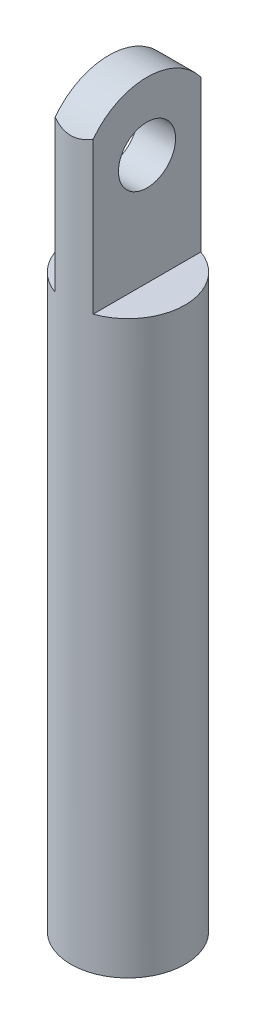
ISO-10303-21;
HEADER;
FILE_DESCRIPTION(('STEP AP214'),'2;1');
FILE_NAME('part.step','',(''),(''),'','','');
FILE_SCHEMA(('AUTOMOTIVE_DESIGN { 1 0 10303 214 1 1 1 1 }'));
ENDSEC;
DATA;
#1=APPLICATION_CONTEXT('core data for automotive mechanical design processes');
#2=APPLICATION_PROTOCOL_DEFINITION('international standard','automotive_design',2000,#1);
#3=PRODUCT_CONTEXT('',#1,'mechanical');
#4=PRODUCT('Part','Part','',(#3));
#5=PRODUCT_RELATED_PRODUCT_CATEGORY('part','',(#4));
#6=PRODUCT_DEFINITION_FORMATION('','',#4);
#7=PRODUCT_DEFINITION_CONTEXT('part definition',#1,'design');
#8=PRODUCT_DEFINITION('design','',#6,#7);
#9=PRODUCT_DEFINITION_SHAPE('','',#8);
#10=(LENGTH_UNIT() NAMED_UNIT(*) SI_UNIT(.MILLI.,.METRE.));
#11=(NAMED_UNIT(*) PLANE_ANGLE_UNIT() SI_UNIT($,.RADIAN.));
#12=(NAMED_UNIT(*) SI_UNIT($,.STERADIAN.) SOLID_ANGLE_UNIT());
#13=UNCERTAINTY_MEASURE_WITH_UNIT(LENGTH_MEASURE(1.E-05),#10,'distance_accuracy_value','');
#14=(GEOMETRIC_REPRESENTATION_CONTEXT(3) GLOBAL_UNCERTAINTY_ASSIGNED_CONTEXT((#13)) GLOBAL_UNIT_ASSIGNED_CONTEXT((#10,
#11,#12)) REPRESENTATION_CONTEXT('',''));
#15=CARTESIAN_POINT('',(0.,0.,0.));
#16=DIRECTION('',(0.,0.,1.));
#17=DIRECTION('',(1.,0.,0.));
#18=AXIS2_PLACEMENT_3D('',#15,#16,#17);
#19=CARTESIAN_POINT('',(1.,10.,0.));
#20=DIRECTION('',(-1.,0.,0.));
#21=DIRECTION('',(0.,0.,1.));
#22=AXIS2_PLACEMENT_3D('',#19,#20,#21);
#23=PLANE('',#22);
#24=CARTESIAN_POINT('',(1.,5.82865668476738,0.));
#25=DIRECTION('',(1.,0.,0.));
#26=DIRECTION('',(0.,0.,-1.));
#27=AXIS2_PLACEMENT_3D('',#24,#25,#26);
#28=CIRCLE('',#27,1.5);
#29=CARTESIAN_POINT('',(1.,5.82865668476738,-1.5));
#30=VERTEX_POINT('',#29);
#31=EDGE_CURVE('E103',#30,#30,#28,.T.);
#32=ORIENTED_EDGE('',*,*,#31,.F.);
#33=EDGE_LOOP('',(#32));
#34=FACE_BOUND('',#33,.T.);
#35=DIRECTION('',(0.,-1.,0.));
#36=VECTOR('',#35,1.);
#37=CARTESIAN_POINT('',(1.,10.,-2.82842712474619));
#38=LINE('',#37,#36);
#39=CARTESIAN_POINT('',(1.,7.96025182246292,-2.82842712474619));
#40=VERTEX_POINT('',#39);
#41=CARTESIAN_POINT('',(1.,0.,-2.82842712474619));
#42=VERTEX_POINT('',#41);
#43=EDGE_CURVE('E89',#40,#42,#38,.T.);
#44=ORIENTED_EDGE('',*,*,#43,.F.);
#45=CARTESIAN_POINT('',(1.,5.82865668476738,0.));
#46=DIRECTION('',(-1.,0.,0.));
#47=DIRECTION('',(0.,0.,1.));
#48=AXIS2_PLACEMENT_3D('',#45,#46,#47);
#49=CIRCLE('',#48,3.54170832100093);
#50=CARTESIAN_POINT('',(1.,7.96025182246292,2.82842712474619));
#51=VERTEX_POINT('',#50);
#52=EDGE_CURVE('E109',#40,#51,#49,.F.);
#53=ORIENTED_EDGE('',*,*,#52,.T.);
#54=DIRECTION('',(0.,-1.,0.));
#55=VECTOR('',#54,1.);
#56=CARTESIAN_POINT('',(1.,10.,2.82842712474619));
#57=LINE('',#56,#55);
#58=CARTESIAN_POINT('',(1.,0.,2.82842712474619));
#59=VERTEX_POINT('',#58);
#60=EDGE_CURVE('E83',#51,#59,#57,.T.);
#61=ORIENTED_EDGE('',*,*,#60,.T.);
#62=DIRECTION('',(0.,0.,-1.));
#63=VECTOR('',#62,1.);
#64=CARTESIAN_POINT('',(1.,0.,0.));
#65=LINE('',#64,#63);
#66=EDGE_CURVE('E102',#59,#42,#65,.T.);
#67=ORIENTED_EDGE('',*,*,#66,.T.);
#68=EDGE_LOOP('',(#44,#53,#61,#67));
#69=FACE_BOUND('',#68,.T.);
#70=ADVANCED_FACE('F33',(#34,#69),#23,.F.);
#71=CARTESIAN_POINT('',(-1.,10.,0.));
#72=DIRECTION('',(-1.,0.,0.));
#73=DIRECTION('',(0.,0.,1.));
#74=AXIS2_PLACEMENT_3D('',#71,#72,#73);
#75=PLANE('',#74);
#76=CARTESIAN_POINT('',(-0.999999999999999,5.82865668476738,0.));
#77=DIRECTION('',(-1.,0.,0.));
#78=DIRECTION('',(0.,0.,1.));
#79=AXIS2_PLACEMENT_3D('',#76,#77,#78);
#80=CIRCLE('',#79,1.5);
#81=CARTESIAN_POINT('',(-0.999999999999999,5.82865668476738,1.5));
#82=VERTEX_POINT('',#81);
#83=EDGE_CURVE('E100',#82,#82,#80,.T.);
#84=ORIENTED_EDGE('',*,*,#83,.F.);
#85=EDGE_LOOP('',(#84));
#86=FACE_BOUND('',#85,.T.);
#87=CARTESIAN_POINT('',(-1.,5.82865668476738,0.));
#88=DIRECTION('',(-1.,0.,0.));
#89=DIRECTION('',(0.,0.,1.));
#90=AXIS2_PLACEMENT_3D('',#87,#88,#89);
#91=CIRCLE('',#90,3.54170832100093);
#92=CARTESIAN_POINT('',(-1.,7.96025182246292,-2.82842712474619));
#93=VERTEX_POINT('',#92);
#94=CARTESIAN_POINT('',(-1.,7.96025182246292,2.82842712474619));
#95=VERTEX_POINT('',#94);
#96=EDGE_CURVE('E11',#93,#95,#91,.F.);
#97=ORIENTED_EDGE('',*,*,#96,.F.);
#98=DIRECTION('',(0.,-1.,0.));
#99=VECTOR('',#98,1.);
#100=CARTESIAN_POINT('',(-1.,10.,-2.82842712474619));
#101=LINE('',#100,#99);
#102=CARTESIAN_POINT('',(-1.,0.,-2.82842712474619));
#103=VERTEX_POINT('',#102);
#104=EDGE_CURVE('E55',#93,#103,#101,.T.);
#105=ORIENTED_EDGE('',*,*,#104,.T.);
#106=DIRECTION('',(0.,0.,-1.));
#107=VECTOR('',#106,1.);
#108=CARTESIAN_POINT('',(-1.,0.,0.));
#109=LINE('',#108,#107);
#110=CARTESIAN_POINT('',(-1.,0.,2.82842712474619));
#111=VERTEX_POINT('',#110);
#112=EDGE_CURVE('E86',#111,#103,#109,.T.);
#113=ORIENTED_EDGE('',*,*,#112,.F.);
#114=DIRECTION('',(0.,-1.,0.));
#115=VECTOR('',#114,1.);
#116=CARTESIAN_POINT('',(-1.,10.,2.82842712474619));
#117=LINE('',#116,#115);
#118=EDGE_CURVE('E81',#95,#111,#117,.T.);
#119=ORIENTED_EDGE('',*,*,#118,.F.);
#120=EDGE_LOOP('',(#97,#105,#113,#119));
#121=FACE_BOUND('',#120,.T.);
#122=ADVANCED_FACE('F85',(#86,#121),#75,.T.);
#123=CARTESIAN_POINT('',(0.,0.,0.));
#124=DIRECTION('',(0.,1.,0.));
#125=DIRECTION('',(0.,0.,1.));
#126=AXIS2_PLACEMENT_3D('',#123,#124,#125);
#127=PLANE('',#126);
#128=CARTESIAN_POINT('',(0.,0.,0.));
#129=DIRECTION('',(0.,1.,0.));
#130=DIRECTION('',(0.,0.,1.));
#131=AXIS2_PLACEMENT_3D('',#128,#129,#130);
#132=CIRCLE('',#131,3.);
#133=EDGE_CURVE('E95',#103,#111,#132,.T.);
#134=ORIENTED_EDGE('',*,*,#133,.T.);
#135=ORIENTED_EDGE('',*,*,#112,.T.);
#136=EDGE_LOOP('',(#134,#135));
#137=FACE_BOUND('',#136,.T.);
#138=ADVANCED_FACE('F115',(#137),#127,.T.);
#139=CARTESIAN_POINT('',(0.,-30.,0.));
#140=DIRECTION('',(0.,1.,0.));
#141=DIRECTION('',(0.,0.,1.));
#142=AXIS2_PLACEMENT_3D('',#139,#140,#141);
#143=CYLINDRICAL_SURFACE('',#142,3.);
#144=CARTESIAN_POINT('',(0.,7.71112788801253,3.));
#145=CARTESIAN_POINT('',(0.103039318652545,7.71115385013826,2.99999054103832));
#146=CARTESIAN_POINT('',(0.206177332899057,7.71977385244027,2.9946264519805));
#147=CARTESIAN_POINT('',(0.409049971081578,7.75241764328388,2.97374819598357));
#148=CARTESIAN_POINT('',(0.508771738545802,7.7764940512868,2.95819935259368));
#149=CARTESIAN_POINT('',(0.742135241413177,7.84794853551902,2.91009346799059));
#150=CARTESIAN_POINT('',(0.873136682748407,7.9008163526107,2.87319653082689));
#151=CARTESIAN_POINT('',(1.12434906923094,8.01850829985186,2.784546060522));
#152=CARTESIAN_POINT('',(1.24452410241534,8.08337018971621,2.73274531265367));
#153=CARTESIAN_POINT('',(1.4453415917332,8.20098862441561,2.63062503896126));
#154=CARTESIAN_POINT('',(1.5282295373278,8.25259425137355,2.583320063074));
#155=CARTESIAN_POINT('',(1.6887346112858,8.35685498616701,2.48137555261116));
#156=CARTESIAN_POINT('',(1.76634928401175,8.40951056837757,2.42673263571073));
#157=CARTESIAN_POINT('',(1.9161869606827,8.51428782376287,2.31024180271093));
#158=CARTESIAN_POINT('',(1.98841583434705,8.56641002314873,2.24840192425155));
#159=CARTESIAN_POINT('',(2.12731967601716,8.66890210196454,2.11745666369643));
#160=CARTESIAN_POINT('',(2.19399407710927,8.71927180222201,2.04835054160058));
#161=CARTESIAN_POINT('',(2.35716306485861,8.84458744146691,1.86188305207283));
#162=CARTESIAN_POINT('',(2.44935703940351,8.91743565768734,1.7392295429631));
#163=CARTESIAN_POINT('',(2.61600600200821,9.05119247249882,1.47668362584459));
#164=CARTESIAN_POINT('',(2.69049065928846,9.11212100988093,1.33682065493431));
#165=CARTESIAN_POINT('',(2.80659196738682,9.20797445585653,1.06794508096358));
#166=CARTESIAN_POINT('',(2.85169602382853,9.24559542423596,0.94141349820674));
#167=CARTESIAN_POINT('',(2.92498565115165,9.3069947708024,0.680298211741778));
#168=CARTESIAN_POINT('',(2.95318100541261,9.33078115344366,0.545719213941322));
#169=CARTESIAN_POINT('',(2.99090904818174,9.36265315559038,0.271467236610506));
#170=CARTESIAN_POINT('',(3.00035746900953,9.37066787999315,0.131774117973588));
#171=CARTESIAN_POINT('',(2.99962186603388,9.37004462732994,-0.147521500665713));
#172=CARTESIAN_POINT('',(2.98943925268788,9.36140784664716,-0.287124006457586));
#173=CARTESIAN_POINT('',(2.95165456482422,9.32949535452524,-0.551625778148248));
#174=CARTESIAN_POINT('',(2.92537382179841,9.30733048197429,-0.676855798242172));
#175=CARTESIAN_POINT('',(2.85811542795837,9.25096392118097,-0.92040814447713));
#176=CARTESIAN_POINT('',(2.81713550306877,9.21676037047877,-1.03872939848415));
#177=CARTESIAN_POINT('',(2.71852958738462,9.1352056226955,-1.27568450495714));
#178=CARTESIAN_POINT('',(2.65983021117627,9.0870184957925,-1.39357874980171));
#179=CARTESIAN_POINT('',(2.52975150388655,8.98173384856214,-1.6177733837655));
#180=CARTESIAN_POINT('',(2.45836199032654,8.92462917736296,-1.7240643511166));
#181=CARTESIAN_POINT('',(2.26688744382456,8.77438531821928,-1.97403053665483));
#182=CARTESIAN_POINT('',(2.14013522219518,8.6773496478751,-2.11033788412406));
#183=CARTESIAN_POINT('',(1.93494502413457,8.52783068832281,-2.29444284863379));
#184=CARTESIAN_POINT('',(1.86391710041156,8.47724927376051,-2.35249201353474));
#185=CARTESIAN_POINT('',(1.71692392406109,8.37594840609881,-2.46181765333375));
#186=CARTESIAN_POINT('',(1.64096030504557,8.3252290039421,-2.51309635224789));
#187=CARTESIAN_POINT('',(1.44277030179379,8.19861350682885,-2.63403776869418));
#188=CARTESIAN_POINT('',(1.31723385046741,8.12351303784083,-2.69917567063907));
#189=CARTESIAN_POINT('',(1.05374505470651,7.9831072833384,-2.81249008221413));
#190=CARTESIAN_POINT('',(0.915830879656366,7.9177734358994,-2.86071662784522));
#191=CARTESIAN_POINT('',(0.679643259389638,7.82828405232621,-2.92353040552561));
#192=CARTESIAN_POINT('',(0.585383291465841,7.79781429993099,-2.94396807510337));
#193=CARTESIAN_POINT('',(0.392319423206918,7.74931830438806,-2.97583746133912));
#194=CARTESIAN_POINT('',(0.293527570634645,7.7312609008517,-2.98729174048763));
#195=CARTESIAN_POINT('',(0.0926755790677443,7.71075120438997,-3.00026597014256));
#196=CARTESIAN_POINT('',(-0.0094059707454303,7.70844080280003,-3.00169559491332));
#197=CARTESIAN_POINT('',(-0.212251395811288,7.72033424696993,-2.99420868043128));
#198=CARTESIAN_POINT('',(-0.313013658472551,7.7345566849705,-2.98528049317573));
#199=CARTESIAN_POINT('',(-0.530985962534681,7.78108406568008,-2.95509976104816));
#200=CARTESIAN_POINT('',(-0.647175360063863,7.81657357501848,-2.93164260025274));
#201=CARTESIAN_POINT('',(-0.871730485339904,7.9005261878839,-2.87291815782699));
#202=CARTESIAN_POINT('',(-0.980067604605757,7.94903397288241,-2.83761009476994));
#203=CARTESIAN_POINT('',(-1.16971255859732,8.04372088533708,-2.7640750711381));
#204=CARTESIAN_POINT('',(-1.2523271317021,8.08868767170383,-2.7275790750428));
#205=CARTESIAN_POINT('',(-1.41276957879532,8.18138320374278,-2.6480380556261));
#206=CARTESIAN_POINT('',(-1.49059460667219,8.22911355954693,-2.60498919013981));
#207=CARTESIAN_POINT('',(-1.64171124989347,8.32576362430349,-2.51249652319031));
#208=CARTESIAN_POINT('',(-1.71499744318189,8.37468466207246,-2.46304528332769));
#209=CARTESIAN_POINT('',(-1.85698481651704,8.47241180411415,-2.35784081138454));
#210=CARTESIAN_POINT('',(-1.92568585974869,8.52121790491541,-2.30208739138851));
#211=CARTESIAN_POINT('',(-2.06092850044289,8.61951432729838,-2.18198638537024));
#212=CARTESIAN_POINT('',(-2.12728347458665,8.66895796565063,-2.11738961499778));
#213=CARTESIAN_POINT('',(-2.2545324400822,8.76547423907831,-1.98135278847187));
#214=CARTESIAN_POINT('',(-2.31542538958974,8.81254642106706,-1.90991143211171));
#215=CARTESIAN_POINT('',(-2.43100355631423,8.90309832412854,-1.7604308365823));
#216=CARTESIAN_POINT('',(-2.4857059356838,8.94658788135904,-1.68241093949558));
#217=CARTESIAN_POINT('',(-2.58833521704277,9.02900729124785,-1.51979242374802));
#218=CARTESIAN_POINT('',(-2.63626300015956,9.06793773676683,-1.43519466284958));
#219=CARTESIAN_POINT('',(-2.74038216877683,9.15314118149194,-1.22806000623917));
#220=CARTESIAN_POINT('',(-2.79332529273548,9.19700287747661,-1.10283915659389));
#221=CARTESIAN_POINT('',(-2.88244960054075,9.27127312309458,-0.842817390418315));
#222=CARTESIAN_POINT('',(-2.91864343426548,9.30169182474631,-0.708023792736473));
#223=CARTESIAN_POINT('',(-2.97220174375013,9.34681945346704,-0.431249427639697));
#224=CARTESIAN_POINT('',(-2.9894532772669,9.36143414239108,-0.289230777004211));
#225=CARTESIAN_POINT('',(-3.0034029863916,9.37324579405262,-0.00347011993683734));
#226=CARTESIAN_POINT('',(-3.00010715479152,9.37044783531882,0.140271371809471));
#227=CARTESIAN_POINT('',(-2.97449523605024,9.3487819673634,0.411353542226561));
#228=CARTESIAN_POINT('',(-2.95394845671245,9.33140903379257,0.538990768065537));
#229=CARTESIAN_POINT('',(-2.89740656795139,9.28385999453756,0.788278752681827));
#230=CARTESIAN_POINT('',(-2.86140788500912,9.2536809272327,0.909928119404918));
#231=CARTESIAN_POINT('',(-2.77363011536835,9.18068510637608,1.15074815923353));
#232=CARTESIAN_POINT('',(-2.72115350783057,9.13731310294258,1.26949257823194));
#233=CARTESIAN_POINT('',(-2.60340140758912,9.04117166229332,1.49621076270768));
#234=CARTESIAN_POINT('',(-2.5381229519655,8.98840004984775,1.60418202605028));
#235=CARTESIAN_POINT('',(-2.36249651673233,8.84875015087193,1.85811926923139));
#236=CARTESIAN_POINT('',(-2.24558971960378,8.7576915654606,1.99731830565895));
#237=CARTESIAN_POINT('',(-2.05540947827743,8.61552761963721,2.18709310815626));
#238=CARTESIAN_POINT('',(-1.98935227853413,8.56707520740669,2.24731408988932));
#239=CARTESIAN_POINT('',(-1.85251819206576,8.46934218107894,2.36137675401973));
#240=CARTESIAN_POINT('',(-1.78174328397709,8.42006192059264,2.41522108484106));
#241=CARTESIAN_POINT('',(-1.63414790303944,8.32086263654871,2.51749526273514));
#242=CARTESIAN_POINT('',(-1.55723693818061,8.27094970841972,2.56580015622674));
#243=CARTESIAN_POINT('',(-1.39843135623567,8.17288289641024,2.6556962712848));
#244=CARTESIAN_POINT('',(-1.31653400136897,8.12473000252324,2.69728375804018));
#245=CARTESIAN_POINT('',(-1.14783123693625,8.03234860826069,2.77326504288379));
#246=CARTESIAN_POINT('',(-1.06104836097208,7.98810417672388,2.80768890093121));
#247=CARTESIAN_POINT('',(-0.882068192405524,7.90601144448542,2.8689560611351));
#248=CARTESIAN_POINT('',(-0.789878565934614,7.86815436924191,2.89580979724919));
#249=CARTESIAN_POINT('',(-0.584619083327635,7.79713420857323,2.94465035130812));
#250=CARTESIAN_POINT('',(-0.470557150961753,7.76566903099938,2.96518884803572));
#251=CARTESIAN_POINT('',(-0.295828452963273,7.73337080340261,2.98595403128695));
#252=CARTESIAN_POINT('',(-0.237096787475354,7.72508970412695,2.99120148628004));
#253=CARTESIAN_POINT('',(-0.118920935289606,7.71396135685969,2.99822681531656));
#254=CARTESIAN_POINT('',(-0.0594769097947691,7.71111290201466,3.00000545995274));
#255=CARTESIAN_POINT('',(0.,7.71112788801253,3.));
#256=B_SPLINE_CURVE_WITH_KNOTS('',3,(#144,#145,#146,#147,#148,#149,#150,#151,#152,#153,#154,
#155,#156,#157,#158,#159,#160,#161,#162,#163,#164,#165,#166,#167,#168,#169,#170,#171,#172,#173,
#174,#175,#176,#177,#178,#179,#180,#181,#182,#183,#184,#185,#186,#187,#188,#189,#190,#191,#192,
#193,#194,#195,#196,#197,#198,#199,#200,#201,#202,#203,#204,#205,#206,#207,#208,#209,#210,#211,
#212,#213,#214,#215,#216,#217,#218,#219,#220,#221,#222,#223,#224,#225,#226,#227,#228,#229,#230,
#231,#232,#233,#234,#235,#236,#237,#238,#239,#240,#241,#242,#243,#244,#245,#246,#247,#248,#249,
#250,#251,#252,#253,#254,#255),.UNSPECIFIED.,.T.,.F.,(4,2,2,2,2,2,2,2,2,2,2,2,2,2,2,2,2,2,2,2,2,
2,2,2,2,2,2,2,2,2,2,2,2,2,2,2,2,2,2,2,2,2,2,2,2,2,2,2,2,2,2,2,2,2,2,4),(0.,0.308854425092571,
0.618765924046725,1.05433046842977,1.49129035197915,1.81640719644534,2.14167441682926,
2.46658179977349,2.79152230365479,3.29908546913704,3.80579220281408,4.22255323033646,
4.63907288657873,5.05746059975746,5.47581825358902,5.86373654621432,6.25171487865645,
6.67088445097909,7.09039189290282,7.7164947573678,8.0305134863343,8.34442880594858,
8.82352733538369,9.30119614198524,9.60366833539903,9.9053783914129,10.2098035100912,
10.514571305839,10.883704539111,11.2541212873836,11.5564163363008,11.8588893184768,
12.1617169270933,12.464553567667,12.779116461462,13.0937392289735,13.4074672155274,
13.7211543599144,14.1479088185913,14.5743404434205,15.003301060161,15.4321365731989,
15.8217038971133,16.2113613637676,16.620453651513,17.0296407334814,17.6360317223668,
17.940837697748,18.2455166303006,18.5560920262776,18.8668395090786,19.1762555025235,
19.48524291677,19.8432576667131,20.0215758971248,20.1998545098055),.UNSPECIFIED.);
#257=EDGE_CURVE('E48',#40,#93,#256,.T.);
#258=ORIENTED_EDGE('',*,*,#257,.F.);
#259=ORIENTED_EDGE('',*,*,#43,.T.);
#260=EDGE_CURVE('E98',#59,#42,#132,.T.);
#261=ORIENTED_EDGE('',*,*,#260,.F.);
#262=ORIENTED_EDGE('',*,*,#60,.F.);
#263=EDGE_CURVE('E74',#95,#51,#256,.T.);
#264=ORIENTED_EDGE('',*,*,#263,.F.);
#265=ORIENTED_EDGE('',*,*,#118,.T.);
#266=ORIENTED_EDGE('',*,*,#133,.F.);
#267=ORIENTED_EDGE('',*,*,#104,.F.);
#268=EDGE_LOOP('',(#258,#259,#261,#262,#264,#265,#266,#267));
#269=FACE_BOUND('',#268,.T.);
#270=CARTESIAN_POINT('',(0.,-30.,0.));
#271=DIRECTION('',(0.,1.,0.));
#272=DIRECTION('',(0.,0.,1.));
#273=AXIS2_PLACEMENT_3D('',#270,#271,#272);
#274=CIRCLE('',#273,3.);
#275=CARTESIAN_POINT('',(0.,-30.,3.));
#276=VERTEX_POINT('',#275);
#277=EDGE_CURVE('E42',#276,#276,#274,.T.);
#278=ORIENTED_EDGE('',*,*,#277,.T.);
#279=EDGE_LOOP('',(#278));
#280=FACE_BOUND('',#279,.T.);
#281=ADVANCED_FACE('F35',(#269,#280),#143,.T.);
#282=CARTESIAN_POINT('',(0.,-30.,0.));
#283=DIRECTION('',(0.,1.,0.));
#284=DIRECTION('',(0.,0.,1.));
#285=AXIS2_PLACEMENT_3D('',#282,#283,#284);
#286=PLANE('',#285);
#287=ORIENTED_EDGE('',*,*,#277,.F.);
#288=EDGE_LOOP('',(#287));
#289=FACE_BOUND('',#288,.T.);
#290=ADVANCED_FACE('F123',(#289),#286,.F.);
#291=ORIENTED_EDGE('',*,*,#66,.F.);
#292=ORIENTED_EDGE('',*,*,#260,.T.);
#293=EDGE_LOOP('',(#291,#292));
#294=FACE_BOUND('',#293,.T.);
#295=ADVANCED_FACE('F120',(#294),#127,.T.);
#296=CARTESIAN_POINT('',(-9.,5.82865668476738,0.));
#297=DIRECTION('',(1.,0.,0.));
#298=DIRECTION('',(0.,0.,-1.));
#299=AXIS2_PLACEMENT_3D('',#296,#297,#298);
#300=CYLINDRICAL_SURFACE('',#299,1.5);
#301=ORIENTED_EDGE('',*,*,#83,.T.);
#302=EDGE_LOOP('',(#301));
#303=FACE_BOUND('',#302,.T.);
#304=ORIENTED_EDGE('',*,*,#31,.T.);
#305=EDGE_LOOP('',(#304));
#306=FACE_BOUND('',#305,.T.);
#307=ADVANCED_FACE('F122',(#303,#306),#300,.F.);
#308=CARTESIAN_POINT('',(-3.,5.82865668476738,0.));
#309=DIRECTION('',(1.,0.,0.));
#310=DIRECTION('',(0.,0.,-1.));
#311=AXIS2_PLACEMENT_3D('',#308,#309,#310);
#312=CYLINDRICAL_SURFACE('',#311,3.54170832100093);
#313=ORIENTED_EDGE('',*,*,#257,.T.);
#314=ORIENTED_EDGE('',*,*,#96,.T.);
#315=ORIENTED_EDGE('',*,*,#263,.T.);
#316=ORIENTED_EDGE('',*,*,#52,.F.);
#317=EDGE_LOOP('',(#313,#314,#315,#316));
#318=FACE_BOUND('',#317,.T.);
#319=ADVANCED_FACE('F73',(#318),#312,.T.);
#320=CLOSED_SHELL('',(#70,#122,#138,#281,#290,#295,#307,#319));
#321=MANIFOLD_SOLID_BREP('B2',#320);
#322=ADVANCED_BREP_SHAPE_REPRESENTATION('',(#18,#321),#14);
#323=SHAPE_DEFINITION_REPRESENTATION(#9,#322);
ENDSEC;
END-ISO-10303-21;
